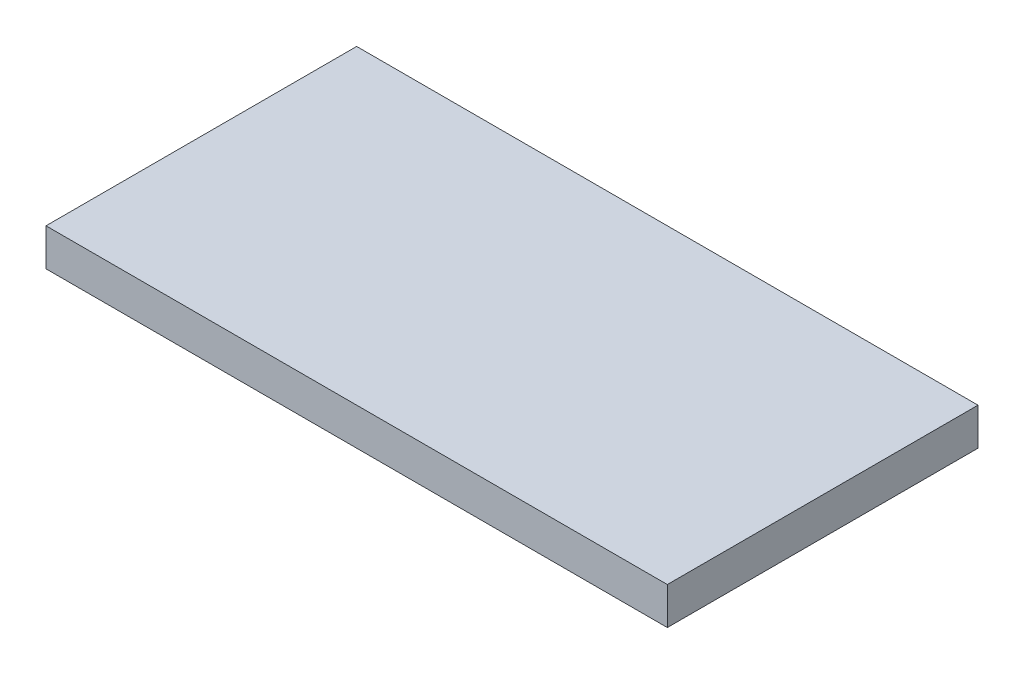
ISO-10303-21;
HEADER;
FILE_DESCRIPTION(('STEP AP214'),'2;1');
FILE_NAME('part.step','',(''),(''),'','','');
FILE_SCHEMA(('AUTOMOTIVE_DESIGN { 1 0 10303 214 1 1 1 1 }'));
ENDSEC;
DATA;
#1=APPLICATION_CONTEXT('core data for automotive mechanical design processes');
#2=APPLICATION_PROTOCOL_DEFINITION('international standard','automotive_design',2000,#1);
#3=PRODUCT_CONTEXT('',#1,'mechanical');
#4=PRODUCT('Part','Part','',(#3));
#5=PRODUCT_RELATED_PRODUCT_CATEGORY('part','',(#4));
#6=PRODUCT_DEFINITION_FORMATION('','',#4);
#7=PRODUCT_DEFINITION_CONTEXT('part definition',#1,'design');
#8=PRODUCT_DEFINITION('design','',#6,#7);
#9=PRODUCT_DEFINITION_SHAPE('','',#8);
#10=(LENGTH_UNIT() NAMED_UNIT(*) SI_UNIT(.MILLI.,.METRE.));
#11=(NAMED_UNIT(*) PLANE_ANGLE_UNIT() SI_UNIT($,.RADIAN.));
#12=(NAMED_UNIT(*) SI_UNIT($,.STERADIAN.) SOLID_ANGLE_UNIT());
#13=UNCERTAINTY_MEASURE_WITH_UNIT(LENGTH_MEASURE(1.E-05),#10,'distance_accuracy_value','');
#14=(GEOMETRIC_REPRESENTATION_CONTEXT(3) GLOBAL_UNCERTAINTY_ASSIGNED_CONTEXT((#13)) GLOBAL_UNIT_ASSIGNED_CONTEXT((#10,
#11,#12)) REPRESENTATION_CONTEXT('',''));
#15=CARTESIAN_POINT('',(0.,0.,0.));
#16=DIRECTION('',(0.,0.,1.));
#17=DIRECTION('',(1.,0.,0.));
#18=AXIS2_PLACEMENT_3D('',#15,#16,#17);
#19=CARTESIAN_POINT('',(0.,6.,0.));
#20=DIRECTION('',(1.,0.,0.));
#21=DIRECTION('',(0.,0.,-1.));
#22=AXIS2_PLACEMENT_3D('',#19,#20,#21);
#23=PLANE('',#22);
#24=DIRECTION('',(0.,0.,1.));
#25=VECTOR('',#24,1.);
#26=CARTESIAN_POINT('',(0.,0.,0.));
#27=LINE('',#26,#25);
#28=CARTESIAN_POINT('',(0.,0.,-50.));
#29=VERTEX_POINT('',#28);
#30=CARTESIAN_POINT('',(0.,0.,0.));
#31=VERTEX_POINT('',#30);
#32=EDGE_CURVE('E95',#29,#31,#27,.T.);
#33=ORIENTED_EDGE('',*,*,#32,.T.);
#34=DIRECTION('',(0.,-1.,0.));
#35=VECTOR('',#34,1.);
#36=CARTESIAN_POINT('',(0.,6.,0.));
#37=LINE('',#36,#35);
#38=CARTESIAN_POINT('',(0.,6.,0.));
#39=VERTEX_POINT('',#38);
#40=EDGE_CURVE('E11',#39,#31,#37,.T.);
#41=ORIENTED_EDGE('',*,*,#40,.F.);
#42=DIRECTION('',(0.,0.,1.));
#43=VECTOR('',#42,1.);
#44=CARTESIAN_POINT('',(0.,6.,0.));
#45=LINE('',#44,#43);
#46=CARTESIAN_POINT('',(0.,6.,-50.));
#47=VERTEX_POINT('',#46);
#48=EDGE_CURVE('E83',#47,#39,#45,.T.);
#49=ORIENTED_EDGE('',*,*,#48,.F.);
#50=DIRECTION('',(0.,-1.,0.));
#51=VECTOR('',#50,1.);
#52=CARTESIAN_POINT('',(0.,6.,-50.));
#53=LINE('',#52,#51);
#54=EDGE_CURVE('E91',#47,#29,#53,.T.);
#55=ORIENTED_EDGE('',*,*,#54,.T.);
#56=EDGE_LOOP('',(#33,#41,#49,#55));
#57=FACE_BOUND('',#56,.T.);
#58=ADVANCED_FACE('F32',(#57),#23,.F.);
#59=CARTESIAN_POINT('',(0.,6.,0.));
#60=DIRECTION('',(0.,0.,-1.));
#61=DIRECTION('',(-1.,0.,0.));
#62=AXIS2_PLACEMENT_3D('',#59,#60,#61);
#63=PLANE('',#62);
#64=DIRECTION('',(1.,0.,0.));
#65=VECTOR('',#64,1.);
#66=CARTESIAN_POINT('',(0.,0.,0.));
#67=LINE('',#66,#65);
#68=CARTESIAN_POINT('',(100.,0.,0.));
#69=VERTEX_POINT('',#68);
#70=EDGE_CURVE('E87',#31,#69,#67,.T.);
#71=ORIENTED_EDGE('',*,*,#70,.T.);
#72=DIRECTION('',(0.,-1.,0.));
#73=VECTOR('',#72,1.);
#74=CARTESIAN_POINT('',(100.,6.,0.));
#75=LINE('',#74,#73);
#76=CARTESIAN_POINT('',(100.,6.,0.));
#77=VERTEX_POINT('',#76);
#78=EDGE_CURVE('E40',#77,#69,#75,.T.);
#79=ORIENTED_EDGE('',*,*,#78,.F.);
#80=DIRECTION('',(1.,0.,0.));
#81=VECTOR('',#80,1.);
#82=CARTESIAN_POINT('',(0.,6.,0.));
#83=LINE('',#82,#81);
#84=EDGE_CURVE('E78',#39,#77,#83,.T.);
#85=ORIENTED_EDGE('',*,*,#84,.F.);
#86=ORIENTED_EDGE('',*,*,#40,.T.);
#87=EDGE_LOOP('',(#71,#79,#85,#86));
#88=FACE_BOUND('',#87,.T.);
#89=ADVANCED_FACE('F86',(#88),#63,.F.);
#90=CARTESIAN_POINT('',(100.,6.,0.));
#91=DIRECTION('',(-1.,0.,0.));
#92=DIRECTION('',(0.,0.,1.));
#93=AXIS2_PLACEMENT_3D('',#90,#91,#92);
#94=PLANE('',#93);
#95=DIRECTION('',(0.,0.,-1.));
#96=VECTOR('',#95,1.);
#97=CARTESIAN_POINT('',(100.,0.,0.));
#98=LINE('',#97,#96);
#99=CARTESIAN_POINT('',(100.,0.,-50.));
#100=VERTEX_POINT('',#99);
#101=EDGE_CURVE('E65',#69,#100,#98,.T.);
#102=ORIENTED_EDGE('',*,*,#101,.T.);
#103=DIRECTION('',(0.,-1.,0.));
#104=VECTOR('',#103,1.);
#105=CARTESIAN_POINT('',(100.,6.,-50.));
#106=LINE('',#105,#104);
#107=CARTESIAN_POINT('',(100.,6.,-50.));
#108=VERTEX_POINT('',#107);
#109=EDGE_CURVE('E88',#108,#100,#106,.T.);
#110=ORIENTED_EDGE('',*,*,#109,.F.);
#111=DIRECTION('',(0.,0.,-1.));
#112=VECTOR('',#111,1.);
#113=CARTESIAN_POINT('',(100.,6.,0.));
#114=LINE('',#113,#112);
#115=EDGE_CURVE('E81',#77,#108,#114,.T.);
#116=ORIENTED_EDGE('',*,*,#115,.F.);
#117=ORIENTED_EDGE('',*,*,#78,.T.);
#118=EDGE_LOOP('',(#102,#110,#116,#117));
#119=FACE_BOUND('',#118,.T.);
#120=ADVANCED_FACE('F89',(#119),#94,.F.);
#121=CARTESIAN_POINT('',(0.,6.,-50.));
#122=DIRECTION('',(0.,0.,1.));
#123=DIRECTION('',(1.,0.,0.));
#124=AXIS2_PLACEMENT_3D('',#121,#122,#123);
#125=PLANE('',#124);
#126=DIRECTION('',(-1.,0.,0.));
#127=VECTOR('',#126,1.);
#128=CARTESIAN_POINT('',(0.,0.,-50.));
#129=LINE('',#128,#127);
#130=EDGE_CURVE('E71',#100,#29,#129,.T.);
#131=ORIENTED_EDGE('',*,*,#130,.T.);
#132=ORIENTED_EDGE('',*,*,#54,.F.);
#133=DIRECTION('',(-1.,0.,0.));
#134=VECTOR('',#133,1.);
#135=CARTESIAN_POINT('',(0.,6.,-50.));
#136=LINE('',#135,#134);
#137=EDGE_CURVE('E48',#108,#47,#136,.T.);
#138=ORIENTED_EDGE('',*,*,#137,.F.);
#139=ORIENTED_EDGE('',*,*,#109,.T.);
#140=EDGE_LOOP('',(#131,#132,#138,#139));
#141=FACE_BOUND('',#140,.T.);
#142=ADVANCED_FACE('F102',(#141),#125,.F.);
#143=CARTESIAN_POINT('',(0.,6.,0.));
#144=DIRECTION('',(0.,-1.,0.));
#145=DIRECTION('',(0.,0.,-1.));
#146=AXIS2_PLACEMENT_3D('',#143,#144,#145);
#147=PLANE('',#146);
#148=ORIENTED_EDGE('',*,*,#48,.T.);
#149=ORIENTED_EDGE('',*,*,#84,.T.);
#150=ORIENTED_EDGE('',*,*,#115,.T.);
#151=ORIENTED_EDGE('',*,*,#137,.T.);
#152=EDGE_LOOP('',(#148,#149,#150,#151));
#153=FACE_BOUND('',#152,.T.);
#154=ADVANCED_FACE('F79',(#153),#147,.F.);
#155=CARTESIAN_POINT('',(0.,0.,0.));
#156=DIRECTION('',(0.,-1.,0.));
#157=DIRECTION('',(0.,0.,-1.));
#158=AXIS2_PLACEMENT_3D('',#155,#156,#157);
#159=PLANE('',#158);
#160=ORIENTED_EDGE('',*,*,#32,.F.);
#161=ORIENTED_EDGE('',*,*,#130,.F.);
#162=ORIENTED_EDGE('',*,*,#101,.F.);
#163=ORIENTED_EDGE('',*,*,#70,.F.);
#164=EDGE_LOOP('',(#160,#161,#162,#163));
#165=FACE_BOUND('',#164,.T.);
#166=ADVANCED_FACE('F105',(#165),#159,.T.);
#167=CLOSED_SHELL('',(#58,#89,#120,#142,#154,#166));
#168=MANIFOLD_SOLID_BREP('B2',#167);
#169=ADVANCED_BREP_SHAPE_REPRESENTATION('',(#18,#168),#14);
#170=SHAPE_DEFINITION_REPRESENTATION(#9,#169);
ENDSEC;
END-ISO-10303-21;
